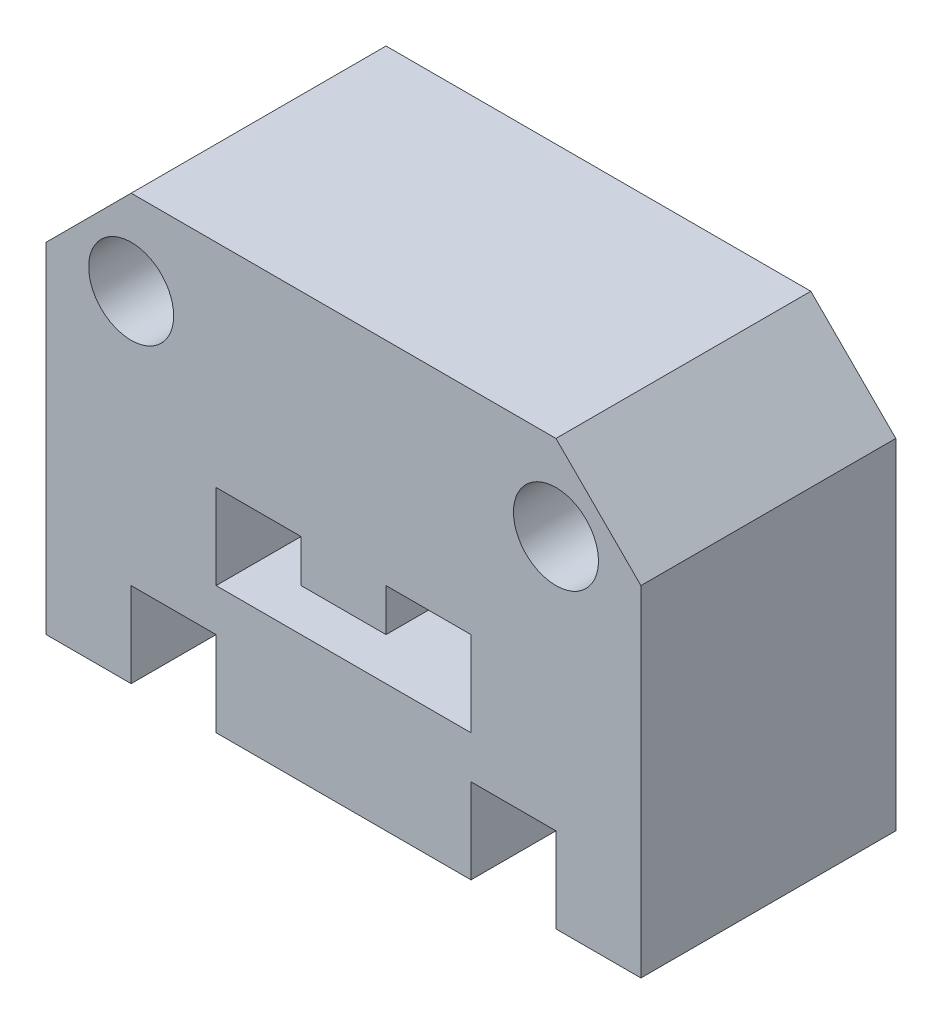
ISO-10303-21;
HEADER;
FILE_DESCRIPTION(('STEP AP214'),'2;1');
FILE_NAME('part.step','',(''),(''),'','','');
FILE_SCHEMA(('AUTOMOTIVE_DESIGN { 1 0 10303 214 1 1 1 1 }'));
ENDSEC;
DATA;
#1=APPLICATION_CONTEXT('core data for automotive mechanical design processes');
#2=APPLICATION_PROTOCOL_DEFINITION('international standard','automotive_design',2000,#1);
#3=PRODUCT_CONTEXT('',#1,'mechanical');
#4=PRODUCT('Part','Part','',(#3));
#5=PRODUCT_RELATED_PRODUCT_CATEGORY('part','',(#4));
#6=PRODUCT_DEFINITION_FORMATION('','',#4);
#7=PRODUCT_DEFINITION_CONTEXT('part definition',#1,'design');
#8=PRODUCT_DEFINITION('design','',#6,#7);
#9=PRODUCT_DEFINITION_SHAPE('','',#8);
#10=(LENGTH_UNIT() NAMED_UNIT(*) SI_UNIT(.MILLI.,.METRE.));
#11=(NAMED_UNIT(*) PLANE_ANGLE_UNIT() SI_UNIT($,.RADIAN.));
#12=(NAMED_UNIT(*) SI_UNIT($,.STERADIAN.) SOLID_ANGLE_UNIT());
#13=UNCERTAINTY_MEASURE_WITH_UNIT(LENGTH_MEASURE(1.E-05),#10,'distance_accuracy_value','');
#14=(GEOMETRIC_REPRESENTATION_CONTEXT(3) GLOBAL_UNCERTAINTY_ASSIGNED_CONTEXT((#13)) GLOBAL_UNIT_ASSIGNED_CONTEXT((#10,
#11,#12)) REPRESENTATION_CONTEXT('',''));
#15=CARTESIAN_POINT('',(0.,0.,0.));
#16=DIRECTION('',(0.,0.,1.));
#17=DIRECTION('',(1.,0.,0.));
#18=AXIS2_PLACEMENT_3D('',#15,#16,#17);
#19=CARTESIAN_POINT('',(0.,0.,15.));
#20=DIRECTION('',(0.,0.,1.));
#21=DIRECTION('',(1.,0.,0.));
#22=AXIS2_PLACEMENT_3D('',#19,#20,#21);
#23=PLANE('',#22);
#24=DIRECTION('',(-1.,0.,0.));
#25=VECTOR('',#24,1.);
#26=CARTESIAN_POINT('',(40.,35.,15.));
#27=LINE('',#26,#25);
#28=CARTESIAN_POINT('',(40.,35.,15.));
#29=VERTEX_POINT('',#28);
#30=CARTESIAN_POINT('',(30.,35.,15.));
#31=VERTEX_POINT('',#30);
#32=EDGE_CURVE('E190',#29,#31,#27,.T.);
#33=ORIENTED_EDGE('',*,*,#32,.F.);
#34=DIRECTION('',(0.,1.,0.));
#35=VECTOR('',#34,1.);
#36=CARTESIAN_POINT('',(40.,30.,15.));
#37=LINE('',#36,#35);
#38=CARTESIAN_POINT('',(40.,30.,15.));
#39=VERTEX_POINT('',#38);
#40=EDGE_CURVE('E182',#39,#29,#37,.T.);
#41=ORIENTED_EDGE('',*,*,#40,.F.);
#42=DIRECTION('',(-1.,0.,0.));
#43=VECTOR('',#42,1.);
#44=CARTESIAN_POINT('',(50.,30.,15.));
#45=LINE('',#44,#43);
#46=CARTESIAN_POINT('',(50.,30.,15.));
#47=VERTEX_POINT('',#46);
#48=EDGE_CURVE('E217',#47,#39,#45,.T.);
#49=ORIENTED_EDGE('',*,*,#48,.F.);
#50=DIRECTION('',(0.,-1.,0.));
#51=VECTOR('',#50,1.);
#52=CARTESIAN_POINT('',(50.,30.,15.));
#53=LINE('',#52,#51);
#54=CARTESIAN_POINT('',(50.,35.,15.));
#55=VERTEX_POINT('',#54);
#56=EDGE_CURVE('E215',#55,#47,#53,.T.);
#57=ORIENTED_EDGE('',*,*,#56,.F.);
#58=DIRECTION('',(-1.,0.,0.));
#59=VECTOR('',#58,1.);
#60=CARTESIAN_POINT('',(50.,35.,15.));
#61=LINE('',#60,#59);
#62=CARTESIAN_POINT('',(60.,35.,15.));
#63=VERTEX_POINT('',#62);
#64=EDGE_CURVE('E213',#63,#55,#61,.T.);
#65=ORIENTED_EDGE('',*,*,#64,.F.);
#66=DIRECTION('',(0.,1.,0.));
#67=VECTOR('',#66,1.);
#68=CARTESIAN_POINT('',(60.,35.,15.));
#69=LINE('',#68,#67);
#70=CARTESIAN_POINT('',(60.,25.,15.));
#71=VERTEX_POINT('',#70);
#72=EDGE_CURVE('E211',#71,#63,#69,.T.);
#73=ORIENTED_EDGE('',*,*,#72,.F.);
#74=DIRECTION('',(1.,0.,0.));
#75=VECTOR('',#74,1.);
#76=CARTESIAN_POINT('',(30.,25.,15.));
#77=LINE('',#76,#75);
#78=CARTESIAN_POINT('',(30.,25.,15.));
#79=VERTEX_POINT('',#78);
#80=EDGE_CURVE('E206',#79,#71,#77,.T.);
#81=ORIENTED_EDGE('',*,*,#80,.F.);
#82=DIRECTION('',(0.,-1.,0.));
#83=VECTOR('',#82,1.);
#84=CARTESIAN_POINT('',(30.,35.,15.));
#85=LINE('',#84,#83);
#86=EDGE_CURVE('E204',#31,#79,#85,.T.);
#87=ORIENTED_EDGE('',*,*,#86,.F.);
#88=EDGE_LOOP('',(#33,#41,#49,#57,#65,#73,#81,#87));
#89=FACE_BOUND('',#88,.T.);
#90=CARTESIAN_POINT('',(20.,50.,15.));
#91=DIRECTION('',(0.,0.,1.));
#92=DIRECTION('',(1.,0.,0.));
#93=AXIS2_PLACEMENT_3D('',#90,#91,#92);
#94=CIRCLE('',#93,5.);
#95=CARTESIAN_POINT('',(25.,50.,15.));
#96=VERTEX_POINT('',#95);
#97=EDGE_CURVE('E250',#96,#96,#94,.T.);
#98=ORIENTED_EDGE('',*,*,#97,.F.);
#99=EDGE_LOOP('',(#98));
#100=FACE_BOUND('',#99,.T.);
#101=DIRECTION('',(-0.707106781186547,-0.707106781186548,0.));
#102=VECTOR('',#101,1.);
#103=CARTESIAN_POINT('',(9.99999999999999,50.,15.));
#104=LINE('',#103,#102);
#105=CARTESIAN_POINT('',(20.,60.,15.));
#106=VERTEX_POINT('',#105);
#107=CARTESIAN_POINT('',(9.99999999999999,50.,15.));
#108=VERTEX_POINT('',#107);
#109=EDGE_CURVE('E256',#106,#108,#104,.T.);
#110=ORIENTED_EDGE('',*,*,#109,.T.);
#111=DIRECTION('',(0.,-1.,0.));
#112=VECTOR('',#111,1.);
#113=CARTESIAN_POINT('',(10.,10.,15.));
#114=LINE('',#113,#112);
#115=CARTESIAN_POINT('',(10.,10.,15.));
#116=VERTEX_POINT('',#115);
#117=EDGE_CURVE('E259',#108,#116,#114,.T.);
#118=ORIENTED_EDGE('',*,*,#117,.T.);
#119=DIRECTION('',(1.,0.,0.));
#120=VECTOR('',#119,1.);
#121=CARTESIAN_POINT('',(10.,10.,15.));
#122=LINE('',#121,#120);
#123=CARTESIAN_POINT('',(20.,10.,15.));
#124=VERTEX_POINT('',#123);
#125=EDGE_CURVE('E262',#116,#124,#122,.T.);
#126=ORIENTED_EDGE('',*,*,#125,.T.);
#127=DIRECTION('',(0.,1.,0.));
#128=VECTOR('',#127,1.);
#129=CARTESIAN_POINT('',(20.,10.,15.));
#130=LINE('',#129,#128);
#131=CARTESIAN_POINT('',(20.,20.,15.));
#132=VERTEX_POINT('',#131);
#133=EDGE_CURVE('E264',#124,#132,#130,.T.);
#134=ORIENTED_EDGE('',*,*,#133,.T.);
#135=DIRECTION('',(1.,0.,0.));
#136=VECTOR('',#135,1.);
#137=CARTESIAN_POINT('',(20.,20.,15.));
#138=LINE('',#137,#136);
#139=CARTESIAN_POINT('',(30.,20.,15.));
#140=VERTEX_POINT('',#139);
#141=EDGE_CURVE('E266',#132,#140,#138,.T.);
#142=ORIENTED_EDGE('',*,*,#141,.T.);
#143=DIRECTION('',(0.,-1.,0.));
#144=VECTOR('',#143,1.);
#145=CARTESIAN_POINT('',(30.,20.,15.));
#146=LINE('',#145,#144);
#147=CARTESIAN_POINT('',(30.,10.,15.));
#148=VERTEX_POINT('',#147);
#149=EDGE_CURVE('E268',#140,#148,#146,.T.);
#150=ORIENTED_EDGE('',*,*,#149,.T.);
#151=DIRECTION('',(1.,0.,0.));
#152=VECTOR('',#151,1.);
#153=CARTESIAN_POINT('',(30.,10.,15.));
#154=LINE('',#153,#152);
#155=CARTESIAN_POINT('',(60.,10.,15.));
#156=VERTEX_POINT('',#155);
#157=EDGE_CURVE('E270',#148,#156,#154,.T.);
#158=ORIENTED_EDGE('',*,*,#157,.T.);
#159=DIRECTION('',(0.,1.,0.));
#160=VECTOR('',#159,1.);
#161=CARTESIAN_POINT('',(60.,20.,15.));
#162=LINE('',#161,#160);
#163=CARTESIAN_POINT('',(60.,20.,15.));
#164=VERTEX_POINT('',#163);
#165=EDGE_CURVE('E272',#156,#164,#162,.T.);
#166=ORIENTED_EDGE('',*,*,#165,.T.);
#167=DIRECTION('',(1.,0.,0.));
#168=VECTOR('',#167,1.);
#169=CARTESIAN_POINT('',(70.,20.,15.));
#170=LINE('',#169,#168);
#171=CARTESIAN_POINT('',(70.,20.,15.));
#172=VERTEX_POINT('',#171);
#173=EDGE_CURVE('E274',#164,#172,#170,.T.);
#174=ORIENTED_EDGE('',*,*,#173,.T.);
#175=DIRECTION('',(0.,-1.,0.));
#176=VECTOR('',#175,1.);
#177=CARTESIAN_POINT('',(70.,10.,15.));
#178=LINE('',#177,#176);
#179=CARTESIAN_POINT('',(70.,10.,15.));
#180=VERTEX_POINT('',#179);
#181=EDGE_CURVE('E276',#172,#180,#178,.T.);
#182=ORIENTED_EDGE('',*,*,#181,.T.);
#183=DIRECTION('',(1.,0.,0.));
#184=VECTOR('',#183,1.);
#185=CARTESIAN_POINT('',(80.,10.,15.));
#186=LINE('',#185,#184);
#187=CARTESIAN_POINT('',(80.,10.,15.));
#188=VERTEX_POINT('',#187);
#189=EDGE_CURVE('E278',#180,#188,#186,.T.);
#190=ORIENTED_EDGE('',*,*,#189,.T.);
#191=DIRECTION('',(0.,1.,0.));
#192=VECTOR('',#191,1.);
#193=CARTESIAN_POINT('',(80.,50.,15.));
#194=LINE('',#193,#192);
#195=CARTESIAN_POINT('',(80.,50.,15.));
#196=VERTEX_POINT('',#195);
#197=EDGE_CURVE('E280',#188,#196,#194,.T.);
#198=ORIENTED_EDGE('',*,*,#197,.T.);
#199=DIRECTION('',(-0.707106781186547,0.707106781186548,0.));
#200=VECTOR('',#199,1.);
#201=CARTESIAN_POINT('',(80.,50.,15.));
#202=LINE('',#201,#200);
#203=CARTESIAN_POINT('',(70.,60.,15.));
#204=VERTEX_POINT('',#203);
#205=EDGE_CURVE('E282',#196,#204,#202,.T.);
#206=ORIENTED_EDGE('',*,*,#205,.T.);
#207=DIRECTION('',(-1.,0.,0.));
#208=VECTOR('',#207,1.);
#209=CARTESIAN_POINT('',(20.,60.,15.));
#210=LINE('',#209,#208);
#211=EDGE_CURVE('E284',#204,#106,#210,.T.);
#212=ORIENTED_EDGE('',*,*,#211,.T.);
#213=EDGE_LOOP('',(#110,#118,#126,#134,#142,#150,#158,#166,#174,#182,#190,#198,#206,#212));
#214=FACE_BOUND('',#213,.T.);
#215=CARTESIAN_POINT('',(70.,50.,15.));
#216=DIRECTION('',(0.,0.,1.));
#217=DIRECTION('',(-1.,0.,0.));
#218=AXIS2_PLACEMENT_3D('',#215,#216,#217);
#219=CIRCLE('',#218,5.00000000000001);
#220=CARTESIAN_POINT('',(65.,50.,15.));
#221=VERTEX_POINT('',#220);
#222=EDGE_CURVE('E220',#221,#221,#219,.T.);
#223=ORIENTED_EDGE('',*,*,#222,.F.);
#224=EDGE_LOOP('',(#223));
#225=FACE_BOUND('',#224,.T.);
#226=ADVANCED_FACE('F33',(#89,#100,#214,#225),#23,.T.);
#227=CARTESIAN_POINT('',(0.,0.,-15.));
#228=DIRECTION('',(0.,0.,1.));
#229=DIRECTION('',(1.,0.,0.));
#230=AXIS2_PLACEMENT_3D('',#227,#228,#229);
#231=PLANE('',#230);
#232=CARTESIAN_POINT('',(20.,50.,-15.));
#233=DIRECTION('',(0.,0.,1.));
#234=DIRECTION('',(1.,0.,0.));
#235=AXIS2_PLACEMENT_3D('',#232,#233,#234);
#236=CIRCLE('',#235,5.);
#237=CARTESIAN_POINT('',(25.,50.,-15.));
#238=VERTEX_POINT('',#237);
#239=EDGE_CURVE('E198',#238,#238,#236,.T.);
#240=ORIENTED_EDGE('',*,*,#239,.T.);
#241=EDGE_LOOP('',(#240));
#242=FACE_BOUND('',#241,.T.);
#243=DIRECTION('',(-0.707106781186547,-0.707106781186548,0.));
#244=VECTOR('',#243,1.);
#245=CARTESIAN_POINT('',(9.99999999999999,50.,-15.));
#246=LINE('',#245,#244);
#247=CARTESIAN_POINT('',(20.,60.,-15.));
#248=VERTEX_POINT('',#247);
#249=CARTESIAN_POINT('',(9.99999999999999,50.,-15.));
#250=VERTEX_POINT('',#249);
#251=EDGE_CURVE('E253',#248,#250,#246,.T.);
#252=ORIENTED_EDGE('',*,*,#251,.F.);
#253=DIRECTION('',(-1.,0.,0.));
#254=VECTOR('',#253,1.);
#255=CARTESIAN_POINT('',(20.,60.,-15.));
#256=LINE('',#255,#254);
#257=CARTESIAN_POINT('',(70.,60.,-15.));
#258=VERTEX_POINT('',#257);
#259=EDGE_CURVE('E260',#258,#248,#256,.T.);
#260=ORIENTED_EDGE('',*,*,#259,.F.);
#261=DIRECTION('',(-0.707106781186547,0.707106781186548,0.));
#262=VECTOR('',#261,1.);
#263=CARTESIAN_POINT('',(80.,50.,-15.));
#264=LINE('',#263,#262);
#265=CARTESIAN_POINT('',(80.,50.,-15.));
#266=VERTEX_POINT('',#265);
#267=EDGE_CURVE('E311',#266,#258,#264,.T.);
#268=ORIENTED_EDGE('',*,*,#267,.F.);
#269=DIRECTION('',(0.,1.,0.));
#270=VECTOR('',#269,1.);
#271=CARTESIAN_POINT('',(80.,50.,-15.));
#272=LINE('',#271,#270);
#273=CARTESIAN_POINT('',(80.,10.,-15.));
#274=VERTEX_POINT('',#273);
#275=EDGE_CURVE('E309',#274,#266,#272,.T.);
#276=ORIENTED_EDGE('',*,*,#275,.F.);
#277=DIRECTION('',(1.,0.,0.));
#278=VECTOR('',#277,1.);
#279=CARTESIAN_POINT('',(80.,10.,-15.));
#280=LINE('',#279,#278);
#281=CARTESIAN_POINT('',(70.,10.,-15.));
#282=VERTEX_POINT('',#281);
#283=EDGE_CURVE('E307',#282,#274,#280,.T.);
#284=ORIENTED_EDGE('',*,*,#283,.F.);
#285=DIRECTION('',(0.,-1.,0.));
#286=VECTOR('',#285,1.);
#287=CARTESIAN_POINT('',(70.,10.,-15.));
#288=LINE('',#287,#286);
#289=CARTESIAN_POINT('',(70.,20.,-15.));
#290=VERTEX_POINT('',#289);
#291=EDGE_CURVE('E305',#290,#282,#288,.T.);
#292=ORIENTED_EDGE('',*,*,#291,.F.);
#293=DIRECTION('',(1.,0.,0.));
#294=VECTOR('',#293,1.);
#295=CARTESIAN_POINT('',(70.,20.,-15.));
#296=LINE('',#295,#294);
#297=CARTESIAN_POINT('',(60.,20.,-15.));
#298=VERTEX_POINT('',#297);
#299=EDGE_CURVE('E303',#298,#290,#296,.T.);
#300=ORIENTED_EDGE('',*,*,#299,.F.);
#301=DIRECTION('',(0.,1.,0.));
#302=VECTOR('',#301,1.);
#303=CARTESIAN_POINT('',(60.,20.,-15.));
#304=LINE('',#303,#302);
#305=CARTESIAN_POINT('',(60.,10.,-15.));
#306=VERTEX_POINT('',#305);
#307=EDGE_CURVE('E301',#306,#298,#304,.T.);
#308=ORIENTED_EDGE('',*,*,#307,.F.);
#309=DIRECTION('',(1.,0.,0.));
#310=VECTOR('',#309,1.);
#311=CARTESIAN_POINT('',(30.,10.,-15.));
#312=LINE('',#311,#310);
#313=CARTESIAN_POINT('',(30.,10.,-15.));
#314=VERTEX_POINT('',#313);
#315=EDGE_CURVE('E299',#314,#306,#312,.T.);
#316=ORIENTED_EDGE('',*,*,#315,.F.);
#317=DIRECTION('',(0.,-1.,0.));
#318=VECTOR('',#317,1.);
#319=CARTESIAN_POINT('',(30.,20.,-15.));
#320=LINE('',#319,#318);
#321=CARTESIAN_POINT('',(30.,20.,-15.));
#322=VERTEX_POINT('',#321);
#323=EDGE_CURVE('E297',#322,#314,#320,.T.);
#324=ORIENTED_EDGE('',*,*,#323,.F.);
#325=DIRECTION('',(1.,0.,0.));
#326=VECTOR('',#325,1.);
#327=CARTESIAN_POINT('',(20.,20.,-15.));
#328=LINE('',#327,#326);
#329=CARTESIAN_POINT('',(20.,20.,-15.));
#330=VERTEX_POINT('',#329);
#331=EDGE_CURVE('E295',#330,#322,#328,.T.);
#332=ORIENTED_EDGE('',*,*,#331,.F.);
#333=DIRECTION('',(0.,1.,0.));
#334=VECTOR('',#333,1.);
#335=CARTESIAN_POINT('',(20.,10.,-15.));
#336=LINE('',#335,#334);
#337=CARTESIAN_POINT('',(20.,10.,-15.));
#338=VERTEX_POINT('',#337);
#339=EDGE_CURVE('E293',#338,#330,#336,.T.);
#340=ORIENTED_EDGE('',*,*,#339,.F.);
#341=DIRECTION('',(1.,0.,0.));
#342=VECTOR('',#341,1.);
#343=CARTESIAN_POINT('',(10.,10.,-15.));
#344=LINE('',#343,#342);
#345=CARTESIAN_POINT('',(10.,10.,-15.));
#346=VERTEX_POINT('',#345);
#347=EDGE_CURVE('E291',#346,#338,#344,.T.);
#348=ORIENTED_EDGE('',*,*,#347,.F.);
#349=DIRECTION('',(0.,-1.,0.));
#350=VECTOR('',#349,1.);
#351=CARTESIAN_POINT('',(10.,10.,-15.));
#352=LINE('',#351,#350);
#353=EDGE_CURVE('E289',#250,#346,#352,.T.);
#354=ORIENTED_EDGE('',*,*,#353,.F.);
#355=EDGE_LOOP('',(#252,#260,#268,#276,#284,#292,#300,#308,#316,#324,#332,#340,#348,#354));
#356=FACE_BOUND('',#355,.T.);
#357=DIRECTION('',(0.,1.,0.));
#358=VECTOR('',#357,1.);
#359=CARTESIAN_POINT('',(40.,30.,-15.));
#360=LINE('',#359,#358);
#361=CARTESIAN_POINT('',(40.,30.,-15.));
#362=VERTEX_POINT('',#361);
#363=CARTESIAN_POINT('',(40.,35.,-15.));
#364=VERTEX_POINT('',#363);
#365=EDGE_CURVE('E56',#362,#364,#360,.T.);
#366=ORIENTED_EDGE('',*,*,#365,.T.);
#367=DIRECTION('',(-1.,0.,0.));
#368=VECTOR('',#367,1.);
#369=CARTESIAN_POINT('',(40.,35.,-15.));
#370=LINE('',#369,#368);
#371=CARTESIAN_POINT('',(30.,35.,-15.));
#372=VERTEX_POINT('',#371);
#373=EDGE_CURVE('E197',#364,#372,#370,.T.);
#374=ORIENTED_EDGE('',*,*,#373,.T.);
#375=DIRECTION('',(0.,-1.,0.));
#376=VECTOR('',#375,1.);
#377=CARTESIAN_POINT('',(30.,35.,-15.));
#378=LINE('',#377,#376);
#379=CARTESIAN_POINT('',(30.,25.,-15.));
#380=VERTEX_POINT('',#379);
#381=EDGE_CURVE('E222',#372,#380,#378,.T.);
#382=ORIENTED_EDGE('',*,*,#381,.T.);
#383=DIRECTION('',(1.,0.,0.));
#384=VECTOR('',#383,1.);
#385=CARTESIAN_POINT('',(30.,25.,-15.));
#386=LINE('',#385,#384);
#387=CARTESIAN_POINT('',(60.,25.,-15.));
#388=VERTEX_POINT('',#387);
#389=EDGE_CURVE('E225',#380,#388,#386,.T.);
#390=ORIENTED_EDGE('',*,*,#389,.T.);
#391=DIRECTION('',(0.,1.,0.));
#392=VECTOR('',#391,1.);
#393=CARTESIAN_POINT('',(60.,35.,-15.));
#394=LINE('',#393,#392);
#395=CARTESIAN_POINT('',(60.,35.,-15.));
#396=VERTEX_POINT('',#395);
#397=EDGE_CURVE('E228',#388,#396,#394,.T.);
#398=ORIENTED_EDGE('',*,*,#397,.T.);
#399=DIRECTION('',(-1.,0.,0.));
#400=VECTOR('',#399,1.);
#401=CARTESIAN_POINT('',(50.,35.,-15.));
#402=LINE('',#401,#400);
#403=CARTESIAN_POINT('',(50.,35.,-15.));
#404=VERTEX_POINT('',#403);
#405=EDGE_CURVE('E231',#396,#404,#402,.T.);
#406=ORIENTED_EDGE('',*,*,#405,.T.);
#407=DIRECTION('',(0.,-1.,0.));
#408=VECTOR('',#407,1.);
#409=CARTESIAN_POINT('',(50.,30.,-15.));
#410=LINE('',#409,#408);
#411=CARTESIAN_POINT('',(50.,30.,-15.));
#412=VERTEX_POINT('',#411);
#413=EDGE_CURVE('E234',#404,#412,#410,.T.);
#414=ORIENTED_EDGE('',*,*,#413,.T.);
#415=DIRECTION('',(-1.,0.,0.));
#416=VECTOR('',#415,1.);
#417=CARTESIAN_POINT('',(50.,30.,-15.));
#418=LINE('',#417,#416);
#419=EDGE_CURVE('E191',#412,#362,#418,.T.);
#420=ORIENTED_EDGE('',*,*,#419,.T.);
#421=EDGE_LOOP('',(#366,#374,#382,#390,#398,#406,#414,#420));
#422=FACE_BOUND('',#421,.T.);
#423=CARTESIAN_POINT('',(70.,50.,-15.));
#424=DIRECTION('',(0.,0.,1.));
#425=DIRECTION('',(-1.,0.,0.));
#426=AXIS2_PLACEMENT_3D('',#423,#424,#425);
#427=CIRCLE('',#426,5.00000000000001);
#428=CARTESIAN_POINT('',(65.,50.,-15.));
#429=VERTEX_POINT('',#428);
#430=EDGE_CURVE('E648',#429,#429,#427,.T.);
#431=ORIENTED_EDGE('',*,*,#430,.T.);
#432=EDGE_LOOP('',(#431));
#433=FACE_BOUND('',#432,.T.);
#434=ADVANCED_FACE('F359',(#242,#356,#422,#433),#231,.F.);
#435=CARTESIAN_POINT('',(9.99999999999999,50.,15.));
#436=DIRECTION('',(0.707106781186548,-0.707106781186547,0.));
#437=DIRECTION('',(0.707106781186547,0.707106781186548,0.));
#438=AXIS2_PLACEMENT_3D('',#435,#436,#437);
#439=PLANE('',#438);
#440=ORIENTED_EDGE('',*,*,#251,.T.);
#441=DIRECTION('',(0.,0.,-1.));
#442=VECTOR('',#441,1.);
#443=CARTESIAN_POINT('',(9.99999999999999,50.,15.));
#444=LINE('',#443,#442);
#445=EDGE_CURVE('E11',#108,#250,#444,.T.);
#446=ORIENTED_EDGE('',*,*,#445,.F.);
#447=ORIENTED_EDGE('',*,*,#109,.F.);
#448=DIRECTION('',(0.,0.,-1.));
#449=VECTOR('',#448,1.);
#450=CARTESIAN_POINT('',(20.,60.,15.));
#451=LINE('',#450,#449);
#452=EDGE_CURVE('E286',#106,#248,#451,.T.);
#453=ORIENTED_EDGE('',*,*,#452,.T.);
#454=EDGE_LOOP('',(#440,#446,#447,#453));
#455=FACE_BOUND('',#454,.T.);
#456=ADVANCED_FACE('F35',(#455),#439,.F.);
#457=CARTESIAN_POINT('',(10.,10.,15.));
#458=DIRECTION('',(1.,0.,0.));
#459=DIRECTION('',(0.,1.,0.));
#460=AXIS2_PLACEMENT_3D('',#457,#458,#459);
#461=PLANE('',#460);
#462=ORIENTED_EDGE('',*,*,#353,.T.);
#463=DIRECTION('',(0.,0.,-1.));
#464=VECTOR('',#463,1.);
#465=CARTESIAN_POINT('',(10.,10.,15.));
#466=LINE('',#465,#464);
#467=EDGE_CURVE('E41',#116,#346,#466,.T.);
#468=ORIENTED_EDGE('',*,*,#467,.F.);
#469=ORIENTED_EDGE('',*,*,#117,.F.);
#470=ORIENTED_EDGE('',*,*,#445,.T.);
#471=EDGE_LOOP('',(#462,#468,#469,#470));
#472=FACE_BOUND('',#471,.T.);
#473=ADVANCED_FACE('F377',(#472),#461,.F.);
#474=CARTESIAN_POINT('',(10.,10.,15.));
#475=DIRECTION('',(0.,1.,0.));
#476=DIRECTION('',(0.,0.,1.));
#477=AXIS2_PLACEMENT_3D('',#474,#475,#476);
#478=PLANE('',#477);
#479=ORIENTED_EDGE('',*,*,#347,.T.);
#480=DIRECTION('',(0.,0.,-1.));
#481=VECTOR('',#480,1.);
#482=CARTESIAN_POINT('',(20.,10.,15.));
#483=LINE('',#482,#481);
#484=EDGE_CURVE('E346',#124,#338,#483,.T.);
#485=ORIENTED_EDGE('',*,*,#484,.F.);
#486=ORIENTED_EDGE('',*,*,#125,.F.);
#487=ORIENTED_EDGE('',*,*,#467,.T.);
#488=EDGE_LOOP('',(#479,#485,#486,#487));
#489=FACE_BOUND('',#488,.T.);
#490=ADVANCED_FACE('F353',(#489),#478,.F.);
#491=CARTESIAN_POINT('',(20.,10.,15.));
#492=DIRECTION('',(-1.,0.,0.));
#493=DIRECTION('',(0.,-1.,0.));
#494=AXIS2_PLACEMENT_3D('',#491,#492,#493);
#495=PLANE('',#494);
#496=ORIENTED_EDGE('',*,*,#339,.T.);
#497=DIRECTION('',(0.,0.,-1.));
#498=VECTOR('',#497,1.);
#499=CARTESIAN_POINT('',(20.,20.,15.));
#500=LINE('',#499,#498);
#501=EDGE_CURVE('E343',#132,#330,#500,.T.);
#502=ORIENTED_EDGE('',*,*,#501,.F.);
#503=ORIENTED_EDGE('',*,*,#133,.F.);
#504=ORIENTED_EDGE('',*,*,#484,.T.);
#505=EDGE_LOOP('',(#496,#502,#503,#504));
#506=FACE_BOUND('',#505,.T.);
#507=ADVANCED_FACE('F365',(#506),#495,.F.);
#508=CARTESIAN_POINT('',(20.,20.,15.));
#509=DIRECTION('',(0.,1.,0.));
#510=DIRECTION('',(-1.,0.,0.));
#511=AXIS2_PLACEMENT_3D('',#508,#509,#510);
#512=PLANE('',#511);
#513=ORIENTED_EDGE('',*,*,#331,.T.);
#514=DIRECTION('',(0.,0.,-1.));
#515=VECTOR('',#514,1.);
#516=CARTESIAN_POINT('',(30.,20.,15.));
#517=LINE('',#516,#515);
#518=EDGE_CURVE('E340',#140,#322,#517,.T.);
#519=ORIENTED_EDGE('',*,*,#518,.F.);
#520=ORIENTED_EDGE('',*,*,#141,.F.);
#521=ORIENTED_EDGE('',*,*,#501,.T.);
#522=EDGE_LOOP('',(#513,#519,#520,#521));
#523=FACE_BOUND('',#522,.T.);
#524=ADVANCED_FACE('F369',(#523),#512,.F.);
#525=CARTESIAN_POINT('',(30.,20.,15.));
#526=DIRECTION('',(1.,0.,0.));
#527=DIRECTION('',(0.,1.,0.));
#528=AXIS2_PLACEMENT_3D('',#525,#526,#527);
#529=PLANE('',#528);
#530=ORIENTED_EDGE('',*,*,#323,.T.);
#531=DIRECTION('',(0.,0.,-1.));
#532=VECTOR('',#531,1.);
#533=CARTESIAN_POINT('',(30.,10.,15.));
#534=LINE('',#533,#532);
#535=EDGE_CURVE('E337',#148,#314,#534,.T.);
#536=ORIENTED_EDGE('',*,*,#535,.F.);
#537=ORIENTED_EDGE('',*,*,#149,.F.);
#538=ORIENTED_EDGE('',*,*,#518,.T.);
#539=EDGE_LOOP('',(#530,#536,#537,#538));
#540=FACE_BOUND('',#539,.T.);
#541=ADVANCED_FACE('F420',(#540),#529,.F.);
#542=CARTESIAN_POINT('',(30.,10.,15.));
#543=DIRECTION('',(0.,1.,0.));
#544=DIRECTION('',(0.,0.,1.));
#545=AXIS2_PLACEMENT_3D('',#542,#543,#544);
#546=PLANE('',#545);
#547=ORIENTED_EDGE('',*,*,#315,.T.);
#548=DIRECTION('',(0.,0.,-1.));
#549=VECTOR('',#548,1.);
#550=CARTESIAN_POINT('',(60.,10.,15.));
#551=LINE('',#550,#549);
#552=EDGE_CURVE('E334',#156,#306,#551,.T.);
#553=ORIENTED_EDGE('',*,*,#552,.F.);
#554=ORIENTED_EDGE('',*,*,#157,.F.);
#555=ORIENTED_EDGE('',*,*,#535,.T.);
#556=EDGE_LOOP('',(#547,#553,#554,#555));
#557=FACE_BOUND('',#556,.T.);
#558=ADVANCED_FACE('F418',(#557),#546,.F.);
#559=CARTESIAN_POINT('',(60.,20.,15.));
#560=DIRECTION('',(-1.,0.,0.));
#561=DIRECTION('',(0.,0.,1.));
#562=AXIS2_PLACEMENT_3D('',#559,#560,#561);
#563=PLANE('',#562);
#564=ORIENTED_EDGE('',*,*,#307,.T.);
#565=DIRECTION('',(0.,0.,-1.));
#566=VECTOR('',#565,1.);
#567=CARTESIAN_POINT('',(60.,20.,15.));
#568=LINE('',#567,#566);
#569=EDGE_CURVE('E331',#164,#298,#568,.T.);
#570=ORIENTED_EDGE('',*,*,#569,.F.);
#571=ORIENTED_EDGE('',*,*,#165,.F.);
#572=ORIENTED_EDGE('',*,*,#552,.T.);
#573=EDGE_LOOP('',(#564,#570,#571,#572));
#574=FACE_BOUND('',#573,.T.);
#575=ADVANCED_FACE('F413',(#574),#563,.F.);
#576=CARTESIAN_POINT('',(70.,20.,15.));
#577=DIRECTION('',(0.,1.,0.));
#578=DIRECTION('',(-1.,0.,0.));
#579=AXIS2_PLACEMENT_3D('',#576,#577,#578);
#580=PLANE('',#579);
#581=ORIENTED_EDGE('',*,*,#299,.T.);
#582=DIRECTION('',(0.,0.,-1.));
#583=VECTOR('',#582,1.);
#584=CARTESIAN_POINT('',(70.,20.,15.));
#585=LINE('',#584,#583);
#586=EDGE_CURVE('E328',#172,#290,#585,.T.);
#587=ORIENTED_EDGE('',*,*,#586,.F.);
#588=ORIENTED_EDGE('',*,*,#173,.F.);
#589=ORIENTED_EDGE('',*,*,#569,.T.);
#590=EDGE_LOOP('',(#581,#587,#588,#589));
#591=FACE_BOUND('',#590,.T.);
#592=ADVANCED_FACE('F408',(#591),#580,.F.);
#593=CARTESIAN_POINT('',(70.,10.,15.));
#594=DIRECTION('',(1.,0.,0.));
#595=DIRECTION('',(0.,1.,0.));
#596=AXIS2_PLACEMENT_3D('',#593,#594,#595);
#597=PLANE('',#596);
#598=ORIENTED_EDGE('',*,*,#291,.T.);
#599=DIRECTION('',(0.,0.,-1.));
#600=VECTOR('',#599,1.);
#601=CARTESIAN_POINT('',(70.,10.,15.));
#602=LINE('',#601,#600);
#603=EDGE_CURVE('E325',#180,#282,#602,.T.);
#604=ORIENTED_EDGE('',*,*,#603,.F.);
#605=ORIENTED_EDGE('',*,*,#181,.F.);
#606=ORIENTED_EDGE('',*,*,#586,.T.);
#607=EDGE_LOOP('',(#598,#604,#605,#606));
#608=FACE_BOUND('',#607,.T.);
#609=ADVANCED_FACE('F404',(#608),#597,.F.);
#610=CARTESIAN_POINT('',(80.,10.,15.));
#611=DIRECTION('',(0.,1.,0.));
#612=DIRECTION('',(-1.,0.,0.));
#613=AXIS2_PLACEMENT_3D('',#610,#611,#612);
#614=PLANE('',#613);
#615=ORIENTED_EDGE('',*,*,#283,.T.);
#616=DIRECTION('',(0.,0.,-1.));
#617=VECTOR('',#616,1.);
#618=CARTESIAN_POINT('',(80.,10.,15.));
#619=LINE('',#618,#617);
#620=EDGE_CURVE('E322',#188,#274,#619,.T.);
#621=ORIENTED_EDGE('',*,*,#620,.F.);
#622=ORIENTED_EDGE('',*,*,#189,.F.);
#623=ORIENTED_EDGE('',*,*,#603,.T.);
#624=EDGE_LOOP('',(#615,#621,#622,#623));
#625=FACE_BOUND('',#624,.T.);
#626=ADVANCED_FACE('F399',(#625),#614,.F.);
#627=CARTESIAN_POINT('',(80.,50.,15.));
#628=DIRECTION('',(-1.,0.,0.));
#629=DIRECTION('',(0.,-1.,0.));
#630=AXIS2_PLACEMENT_3D('',#627,#628,#629);
#631=PLANE('',#630);
#632=ORIENTED_EDGE('',*,*,#275,.T.);
#633=DIRECTION('',(0.,0.,-1.));
#634=VECTOR('',#633,1.);
#635=CARTESIAN_POINT('',(80.,50.,15.));
#636=LINE('',#635,#634);
#637=EDGE_CURVE('E319',#196,#266,#636,.T.);
#638=ORIENTED_EDGE('',*,*,#637,.F.);
#639=ORIENTED_EDGE('',*,*,#197,.F.);
#640=ORIENTED_EDGE('',*,*,#620,.T.);
#641=EDGE_LOOP('',(#632,#638,#639,#640));
#642=FACE_BOUND('',#641,.T.);
#643=ADVANCED_FACE('F393',(#642),#631,.F.);
#644=CARTESIAN_POINT('',(80.,50.,15.));
#645=DIRECTION('',(-0.707106781186548,-0.707106781186547,0.));
#646=DIRECTION('',(0.707106781186547,-0.707106781186548,0.));
#647=AXIS2_PLACEMENT_3D('',#644,#645,#646);
#648=PLANE('',#647);
#649=ORIENTED_EDGE('',*,*,#267,.T.);
#650=DIRECTION('',(0.,0.,-1.));
#651=VECTOR('',#650,1.);
#652=CARTESIAN_POINT('',(70.,60.,15.));
#653=LINE('',#652,#651);
#654=EDGE_CURVE('E316',#204,#258,#653,.T.);
#655=ORIENTED_EDGE('',*,*,#654,.F.);
#656=ORIENTED_EDGE('',*,*,#205,.F.);
#657=ORIENTED_EDGE('',*,*,#637,.T.);
#658=EDGE_LOOP('',(#649,#655,#656,#657));
#659=FACE_BOUND('',#658,.T.);
#660=ADVANCED_FACE('F389',(#659),#648,.F.);
#661=CARTESIAN_POINT('',(20.,60.,15.));
#662=DIRECTION('',(0.,-1.,0.));
#663=DIRECTION('',(0.,0.,-1.));
#664=AXIS2_PLACEMENT_3D('',#661,#662,#663);
#665=PLANE('',#664);
#666=ORIENTED_EDGE('',*,*,#259,.T.);
#667=ORIENTED_EDGE('',*,*,#452,.F.);
#668=ORIENTED_EDGE('',*,*,#211,.F.);
#669=ORIENTED_EDGE('',*,*,#654,.T.);
#670=EDGE_LOOP('',(#666,#667,#668,#669));
#671=FACE_BOUND('',#670,.T.);
#672=ADVANCED_FACE('F384',(#671),#665,.F.);
#673=CARTESIAN_POINT('',(20.,50.,15.));
#674=DIRECTION('',(0.,0.,-1.));
#675=DIRECTION('',(-1.,0.,0.));
#676=AXIS2_PLACEMENT_3D('',#673,#674,#675);
#677=CYLINDRICAL_SURFACE('',#676,5.);
#678=ORIENTED_EDGE('',*,*,#97,.T.);
#679=EDGE_LOOP('',(#678));
#680=FACE_BOUND('',#679,.T.);
#681=ORIENTED_EDGE('',*,*,#239,.F.);
#682=EDGE_LOOP('',(#681));
#683=FACE_BOUND('',#682,.T.);
#684=ADVANCED_FACE('F437',(#680,#683),#677,.F.);
#685=CARTESIAN_POINT('',(40.,30.,15.));
#686=DIRECTION('',(-1.,0.,0.));
#687=DIRECTION('',(0.,-1.,0.));
#688=AXIS2_PLACEMENT_3D('',#685,#686,#687);
#689=PLANE('',#688);
#690=ORIENTED_EDGE('',*,*,#365,.F.);
#691=DIRECTION('',(0.,0.,-1.));
#692=VECTOR('',#691,1.);
#693=CARTESIAN_POINT('',(40.,30.,15.));
#694=LINE('',#693,#692);
#695=EDGE_CURVE('E186',#39,#362,#694,.T.);
#696=ORIENTED_EDGE('',*,*,#695,.F.);
#697=ORIENTED_EDGE('',*,*,#40,.T.);
#698=DIRECTION('',(0.,0.,-1.));
#699=VECTOR('',#698,1.);
#700=CARTESIAN_POINT('',(40.,35.,15.));
#701=LINE('',#700,#699);
#702=EDGE_CURVE('E185',#29,#364,#701,.T.);
#703=ORIENTED_EDGE('',*,*,#702,.T.);
#704=EDGE_LOOP('',(#690,#696,#697,#703));
#705=FACE_BOUND('',#704,.T.);
#706=ADVANCED_FACE('F184',(#705),#689,.T.);
#707=CARTESIAN_POINT('',(40.,35.,15.));
#708=DIRECTION('',(0.,-1.,0.));
#709=DIRECTION('',(0.,0.,-1.));
#710=AXIS2_PLACEMENT_3D('',#707,#708,#709);
#711=PLANE('',#710);
#712=ORIENTED_EDGE('',*,*,#373,.F.);
#713=ORIENTED_EDGE('',*,*,#702,.F.);
#714=ORIENTED_EDGE('',*,*,#32,.T.);
#715=DIRECTION('',(0.,0.,-1.));
#716=VECTOR('',#715,1.);
#717=CARTESIAN_POINT('',(30.,35.,15.));
#718=LINE('',#717,#716);
#719=EDGE_CURVE('E199',#31,#372,#718,.T.);
#720=ORIENTED_EDGE('',*,*,#719,.T.);
#721=EDGE_LOOP('',(#712,#713,#714,#720));
#722=FACE_BOUND('',#721,.T.);
#723=ADVANCED_FACE('F194',(#722),#711,.T.);
#724=CARTESIAN_POINT('',(30.,35.,15.));
#725=DIRECTION('',(1.,0.,0.));
#726=DIRECTION('',(0.,1.,0.));
#727=AXIS2_PLACEMENT_3D('',#724,#725,#726);
#728=PLANE('',#727);
#729=ORIENTED_EDGE('',*,*,#381,.F.);
#730=ORIENTED_EDGE('',*,*,#719,.F.);
#731=ORIENTED_EDGE('',*,*,#86,.T.);
#732=DIRECTION('',(0.,0.,-1.));
#733=VECTOR('',#732,1.);
#734=CARTESIAN_POINT('',(30.,25.,15.));
#735=LINE('',#734,#733);
#736=EDGE_CURVE('E247',#79,#380,#735,.T.);
#737=ORIENTED_EDGE('',*,*,#736,.T.);
#738=EDGE_LOOP('',(#729,#730,#731,#737));
#739=FACE_BOUND('',#738,.T.);
#740=ADVANCED_FACE('F498',(#739),#728,.T.);
#741=CARTESIAN_POINT('',(30.,25.,15.));
#742=DIRECTION('',(0.,1.,0.));
#743=DIRECTION('',(0.,0.,1.));
#744=AXIS2_PLACEMENT_3D('',#741,#742,#743);
#745=PLANE('',#744);
#746=ORIENTED_EDGE('',*,*,#389,.F.);
#747=ORIENTED_EDGE('',*,*,#736,.F.);
#748=ORIENTED_EDGE('',*,*,#80,.T.);
#749=DIRECTION('',(0.,0.,-1.));
#750=VECTOR('',#749,1.);
#751=CARTESIAN_POINT('',(60.,25.,15.));
#752=LINE('',#751,#750);
#753=EDGE_CURVE('E245',#71,#388,#752,.T.);
#754=ORIENTED_EDGE('',*,*,#753,.T.);
#755=EDGE_LOOP('',(#746,#747,#748,#754));
#756=FACE_BOUND('',#755,.T.);
#757=ADVANCED_FACE('F505',(#756),#745,.T.);
#758=CARTESIAN_POINT('',(60.,35.,15.));
#759=DIRECTION('',(-1.,0.,0.));
#760=DIRECTION('',(0.,0.,1.));
#761=AXIS2_PLACEMENT_3D('',#758,#759,#760);
#762=PLANE('',#761);
#763=ORIENTED_EDGE('',*,*,#397,.F.);
#764=ORIENTED_EDGE('',*,*,#753,.F.);
#765=ORIENTED_EDGE('',*,*,#72,.T.);
#766=DIRECTION('',(0.,0.,-1.));
#767=VECTOR('',#766,1.);
#768=CARTESIAN_POINT('',(60.,35.,15.));
#769=LINE('',#768,#767);
#770=EDGE_CURVE('E243',#63,#396,#769,.T.);
#771=ORIENTED_EDGE('',*,*,#770,.T.);
#772=EDGE_LOOP('',(#763,#764,#765,#771));
#773=FACE_BOUND('',#772,.T.);
#774=ADVANCED_FACE('F513',(#773),#762,.T.);
#775=CARTESIAN_POINT('',(50.,35.,15.));
#776=DIRECTION('',(0.,-1.,0.));
#777=DIRECTION('',(0.,0.,-1.));
#778=AXIS2_PLACEMENT_3D('',#775,#776,#777);
#779=PLANE('',#778);
#780=ORIENTED_EDGE('',*,*,#405,.F.);
#781=ORIENTED_EDGE('',*,*,#770,.F.);
#782=ORIENTED_EDGE('',*,*,#64,.T.);
#783=DIRECTION('',(0.,0.,-1.));
#784=VECTOR('',#783,1.);
#785=CARTESIAN_POINT('',(50.,35.,15.));
#786=LINE('',#785,#784);
#787=EDGE_CURVE('E241',#55,#404,#786,.T.);
#788=ORIENTED_EDGE('',*,*,#787,.T.);
#789=EDGE_LOOP('',(#780,#781,#782,#788));
#790=FACE_BOUND('',#789,.T.);
#791=ADVANCED_FACE('F521',(#790),#779,.T.);
#792=CARTESIAN_POINT('',(50.,30.,15.));
#793=DIRECTION('',(1.,0.,0.));
#794=DIRECTION('',(0.,1.,0.));
#795=AXIS2_PLACEMENT_3D('',#792,#793,#794);
#796=PLANE('',#795);
#797=ORIENTED_EDGE('',*,*,#413,.F.);
#798=ORIENTED_EDGE('',*,*,#787,.F.);
#799=ORIENTED_EDGE('',*,*,#56,.T.);
#800=DIRECTION('',(0.,0.,-1.));
#801=VECTOR('',#800,1.);
#802=CARTESIAN_POINT('',(50.,30.,15.));
#803=LINE('',#802,#801);
#804=EDGE_CURVE('E48',#47,#412,#803,.T.);
#805=ORIENTED_EDGE('',*,*,#804,.T.);
#806=EDGE_LOOP('',(#797,#798,#799,#805));
#807=FACE_BOUND('',#806,.T.);
#808=ADVANCED_FACE('F529',(#807),#796,.T.);
#809=CARTESIAN_POINT('',(50.,30.,15.));
#810=DIRECTION('',(0.,-1.,0.));
#811=DIRECTION('',(0.,0.,-1.));
#812=AXIS2_PLACEMENT_3D('',#809,#810,#811);
#813=PLANE('',#812);
#814=ORIENTED_EDGE('',*,*,#419,.F.);
#815=ORIENTED_EDGE('',*,*,#804,.F.);
#816=ORIENTED_EDGE('',*,*,#48,.T.);
#817=ORIENTED_EDGE('',*,*,#695,.T.);
#818=EDGE_LOOP('',(#814,#815,#816,#817));
#819=FACE_BOUND('',#818,.T.);
#820=ADVANCED_FACE('F537',(#819),#813,.T.);
#821=CARTESIAN_POINT('',(70.,50.,15.));
#822=DIRECTION('',(0.,0.,-1.));
#823=DIRECTION('',(-1.,0.,0.));
#824=AXIS2_PLACEMENT_3D('',#821,#822,#823);
#825=CYLINDRICAL_SURFACE('',#824,5.00000000000001);
#826=ORIENTED_EDGE('',*,*,#222,.T.);
#827=EDGE_LOOP('',(#826));
#828=FACE_BOUND('',#827,.T.);
#829=ORIENTED_EDGE('',*,*,#430,.F.);
#830=EDGE_LOOP('',(#829));
#831=FACE_BOUND('',#830,.T.);
#832=ADVANCED_FACE('F545',(#828,#831),#825,.F.);
#833=CLOSED_SHELL('',(#226,#434,#456,#473,#490,#507,#524,#541,#558,#575,#592,#609,#626,#643,
#660,#672,#684,#706,#723,#740,#757,#774,#791,#808,#820,#832));
#834=MANIFOLD_SOLID_BREP('B2',#833);
#835=ADVANCED_BREP_SHAPE_REPRESENTATION('',(#18,#834),#14);
#836=SHAPE_DEFINITION_REPRESENTATION(#9,#835);
ENDSEC;
END-ISO-10303-21;
